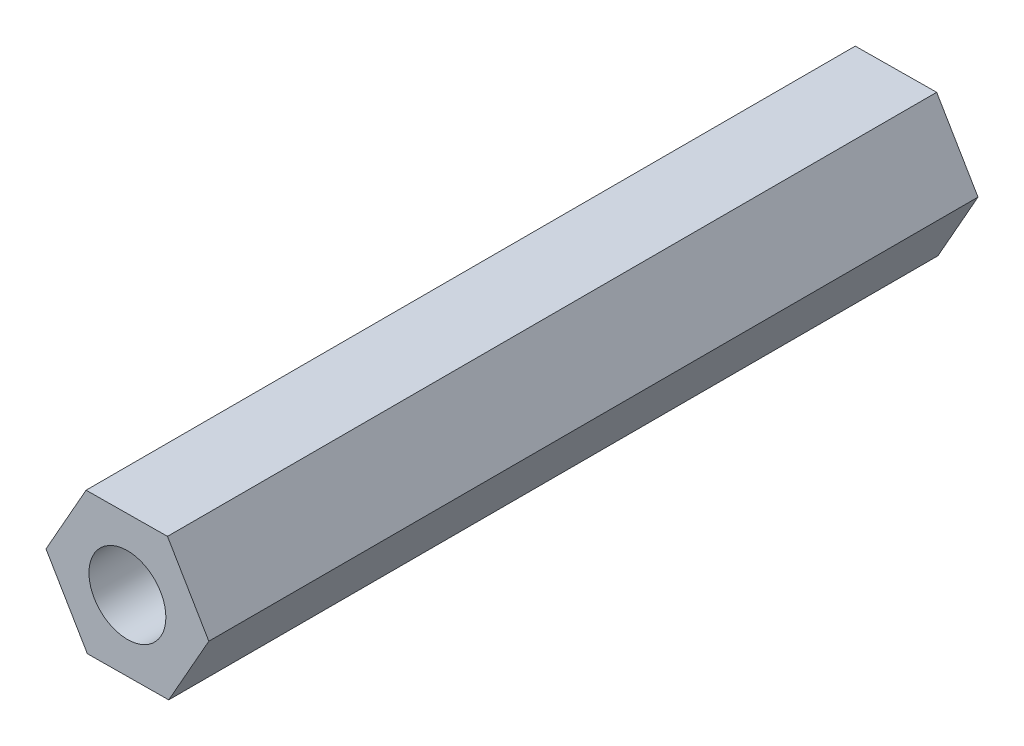
ISO-10303-21;
HEADER;
FILE_DESCRIPTION(('STEP AP214'),'2;1');
FILE_NAME('part.step','',(''),(''),'','','');
FILE_SCHEMA(('AUTOMOTIVE_DESIGN { 1 0 10303 214 1 1 1 1 }'));
ENDSEC;
DATA;
#1=APPLICATION_CONTEXT('core data for automotive mechanical design processes');
#2=APPLICATION_PROTOCOL_DEFINITION('international standard','automotive_design',2000,#1);
#3=PRODUCT_CONTEXT('',#1,'mechanical');
#4=PRODUCT('Part','Part','',(#3));
#5=PRODUCT_RELATED_PRODUCT_CATEGORY('part','',(#4));
#6=PRODUCT_DEFINITION_FORMATION('','',#4);
#7=PRODUCT_DEFINITION_CONTEXT('part definition',#1,'design');
#8=PRODUCT_DEFINITION('design','',#6,#7);
#9=PRODUCT_DEFINITION_SHAPE('','',#8);
#10=(LENGTH_UNIT() NAMED_UNIT(*) SI_UNIT(.MILLI.,.METRE.));
#11=(NAMED_UNIT(*) PLANE_ANGLE_UNIT() SI_UNIT($,.RADIAN.));
#12=(NAMED_UNIT(*) SI_UNIT($,.STERADIAN.) SOLID_ANGLE_UNIT());
#13=UNCERTAINTY_MEASURE_WITH_UNIT(LENGTH_MEASURE(1.E-05),#10,'distance_accuracy_value','');
#14=(GEOMETRIC_REPRESENTATION_CONTEXT(3) GLOBAL_UNCERTAINTY_ASSIGNED_CONTEXT((#13)) GLOBAL_UNIT_ASSIGNED_CONTEXT((#10,
#11,#12)) REPRESENTATION_CONTEXT('',''));
#15=CARTESIAN_POINT('',(0.,0.,0.));
#16=DIRECTION('',(0.,0.,1.));
#17=DIRECTION('',(1.,0.,0.));
#18=AXIS2_PLACEMENT_3D('',#15,#16,#17);
#19=CARTESIAN_POINT('',(0.,0.,30.));
#20=DIRECTION('',(0.,0.,1.));
#21=DIRECTION('',(1.,0.,0.));
#22=AXIS2_PLACEMENT_3D('',#19,#20,#21);
#23=PLANE('',#22);
#24=DIRECTION('',(0.999961257640527,0.00880245522430783,0.));
#25=VECTOR('',#24,1.);
#26=CARTESIAN_POINT('',(-1.56344497664753,-2.76386923321798,30.));
#27=LINE('',#26,#25);
#28=CARTESIAN_POINT('',(-1.56344497664753,-2.76386923321798,30.));
#29=VERTEX_POINT('',#28);
#30=CARTESIAN_POINT('',(1.61185848038122,-2.73591768380492,30.));
#31=VERTEX_POINT('',#30);
#32=EDGE_CURVE('E132',#29,#31,#27,.T.);
#33=ORIENTED_EDGE('',*,*,#32,.T.);
#34=DIRECTION('',(0.492357478980338,0.870393079529086,0.));
#35=VECTOR('',#34,1.);
#36=CARTESIAN_POINT('',(1.61185848038122,-2.73591768380492,30.));
#37=LINE('',#36,#35);
#38=CARTESIAN_POINT('',(3.17530345702875,0.0279515494130611,30.));
#39=VERTEX_POINT('',#38);
#40=EDGE_CURVE('E90',#31,#39,#37,.T.);
#41=ORIENTED_EDGE('',*,*,#40,.T.);
#42=DIRECTION('',(-0.507603778660189,0.861590624304778,0.));
#43=VECTOR('',#42,1.);
#44=CARTESIAN_POINT('',(3.17530345702875,0.0279515494130611,30.));
#45=LINE('',#44,#43);
#46=CARTESIAN_POINT('',(1.56344497664753,2.76386923321798,30.));
#47=VERTEX_POINT('',#46);
#48=EDGE_CURVE('E103',#39,#47,#45,.T.);
#49=ORIENTED_EDGE('',*,*,#48,.T.);
#50=DIRECTION('',(-0.999961257640527,-0.00880245522430783,0.));
#51=VECTOR('',#50,1.);
#52=CARTESIAN_POINT('',(1.56344497664753,2.76386923321798,30.));
#53=LINE('',#52,#51);
#54=CARTESIAN_POINT('',(-1.61185848038122,2.73591768380492,30.));
#55=VERTEX_POINT('',#54);
#56=EDGE_CURVE('E97',#47,#55,#53,.T.);
#57=ORIENTED_EDGE('',*,*,#56,.T.);
#58=DIRECTION('',(-0.492357478980338,-0.870393079529086,0.));
#59=VECTOR('',#58,1.);
#60=CARTESIAN_POINT('',(-1.61185848038122,2.73591768380492,30.));
#61=LINE('',#60,#59);
#62=CARTESIAN_POINT('',(-3.17530345702875,-0.02795154941306,30.));
#63=VERTEX_POINT('',#62);
#64=EDGE_CURVE('E101',#55,#63,#61,.T.);
#65=ORIENTED_EDGE('',*,*,#64,.T.);
#66=DIRECTION('',(0.507603778660189,-0.861590624304779,0.));
#67=VECTOR('',#66,1.);
#68=CARTESIAN_POINT('',(-3.17530345702875,-0.02795154941306,30.));
#69=LINE('',#68,#67);
#70=EDGE_CURVE('E53',#63,#29,#69,.T.);
#71=ORIENTED_EDGE('',*,*,#70,.T.);
#72=EDGE_LOOP('',(#33,#41,#49,#57,#65,#71));
#73=FACE_BOUND('',#72,.T.);
#74=CARTESIAN_POINT('',(0.,0.,30.));
#75=DIRECTION('',(0.,0.,1.));
#76=DIRECTION('',(1.,0.,0.));
#77=AXIS2_PLACEMENT_3D('',#74,#75,#76);
#78=CIRCLE('',#77,1.5);
#79=CARTESIAN_POINT('',(1.5,0.,30.));
#80=VERTEX_POINT('',#79);
#81=EDGE_CURVE('E125',#80,#80,#78,.T.);
#82=ORIENTED_EDGE('',*,*,#81,.F.);
#83=EDGE_LOOP('',(#82));
#84=FACE_BOUND('',#83,.T.);
#85=ADVANCED_FACE('F36',(#73,#84),#23,.T.);
#86=CARTESIAN_POINT('',(0.,0.,0.));
#87=DIRECTION('',(0.,0.,1.));
#88=DIRECTION('',(1.,0.,0.));
#89=AXIS2_PLACEMENT_3D('',#86,#87,#88);
#90=PLANE('',#89);
#91=DIRECTION('',(0.999961257640527,0.00880245522430783,0.));
#92=VECTOR('',#91,1.);
#93=CARTESIAN_POINT('',(-1.56344497664753,-2.76386923321798,0.));
#94=LINE('',#93,#92);
#95=CARTESIAN_POINT('',(-1.56344497664753,-2.76386923321798,0.));
#96=VERTEX_POINT('',#95);
#97=CARTESIAN_POINT('',(1.61185848038122,-2.73591768380492,0.));
#98=VERTEX_POINT('',#97);
#99=EDGE_CURVE('E121',#96,#98,#94,.T.);
#100=ORIENTED_EDGE('',*,*,#99,.F.);
#101=DIRECTION('',(0.507603778660189,-0.861590624304779,0.));
#102=VECTOR('',#101,1.);
#103=CARTESIAN_POINT('',(-3.17530345702875,-0.02795154941306,0.));
#104=LINE('',#103,#102);
#105=CARTESIAN_POINT('',(-3.17530345702875,-0.02795154941306,0.));
#106=VERTEX_POINT('',#105);
#107=EDGE_CURVE('E82',#106,#96,#104,.T.);
#108=ORIENTED_EDGE('',*,*,#107,.F.);
#109=DIRECTION('',(-0.492357478980338,-0.870393079529086,0.));
#110=VECTOR('',#109,1.);
#111=CARTESIAN_POINT('',(-1.61185848038122,2.73591768380492,0.));
#112=LINE('',#111,#110);
#113=CARTESIAN_POINT('',(-1.61185848038122,2.73591768380492,0.));
#114=VERTEX_POINT('',#113);
#115=EDGE_CURVE('E76',#114,#106,#112,.T.);
#116=ORIENTED_EDGE('',*,*,#115,.F.);
#117=DIRECTION('',(-0.999961257640527,-0.00880245522430783,0.));
#118=VECTOR('',#117,1.);
#119=CARTESIAN_POINT('',(1.56344497664753,2.76386923321798,0.));
#120=LINE('',#119,#118);
#121=CARTESIAN_POINT('',(1.56344497664753,2.76386923321798,0.));
#122=VERTEX_POINT('',#121);
#123=EDGE_CURVE('E111',#122,#114,#120,.T.);
#124=ORIENTED_EDGE('',*,*,#123,.F.);
#125=DIRECTION('',(-0.507603778660189,0.861590624304778,0.));
#126=VECTOR('',#125,1.);
#127=CARTESIAN_POINT('',(3.17530345702875,0.0279515494130611,0.));
#128=LINE('',#127,#126);
#129=CARTESIAN_POINT('',(3.17530345702875,0.0279515494130611,0.));
#130=VERTEX_POINT('',#129);
#131=EDGE_CURVE('E127',#130,#122,#128,.T.);
#132=ORIENTED_EDGE('',*,*,#131,.F.);
#133=DIRECTION('',(0.492357478980338,0.870393079529086,0.));
#134=VECTOR('',#133,1.);
#135=CARTESIAN_POINT('',(1.61185848038122,-2.73591768380492,0.));
#136=LINE('',#135,#134);
#137=EDGE_CURVE('E124',#98,#130,#136,.T.);
#138=ORIENTED_EDGE('',*,*,#137,.F.);
#139=EDGE_LOOP('',(#100,#108,#116,#124,#132,#138));
#140=FACE_BOUND('',#139,.T.);
#141=CARTESIAN_POINT('',(0.,0.,0.));
#142=DIRECTION('',(0.,0.,1.));
#143=DIRECTION('',(1.,0.,0.));
#144=AXIS2_PLACEMENT_3D('',#141,#142,#143);
#145=CIRCLE('',#144,1.5);
#146=CARTESIAN_POINT('',(1.5,0.,0.));
#147=VERTEX_POINT('',#146);
#148=EDGE_CURVE('E225',#147,#147,#145,.T.);
#149=ORIENTED_EDGE('',*,*,#148,.T.);
#150=EDGE_LOOP('',(#149));
#151=FACE_BOUND('',#150,.T.);
#152=ADVANCED_FACE('F141',(#140,#151),#90,.F.);
#153=CARTESIAN_POINT('',(-1.56344497664753,-2.76386923321798,30.));
#154=DIRECTION('',(-0.00880245522430783,0.999961257640527,0.));
#155=DIRECTION('',(-0.999961257640527,-0.00880245522430783,0.));
#156=AXIS2_PLACEMENT_3D('',#153,#154,#155);
#157=PLANE('',#156);
#158=ORIENTED_EDGE('',*,*,#99,.T.);
#159=DIRECTION('',(0.,0.,-1.));
#160=VECTOR('',#159,1.);
#161=CARTESIAN_POINT('',(1.61185848038122,-2.73591768380492,30.));
#162=LINE('',#161,#160);
#163=EDGE_CURVE('E11',#31,#98,#162,.T.);
#164=ORIENTED_EDGE('',*,*,#163,.F.);
#165=ORIENTED_EDGE('',*,*,#32,.F.);
#166=DIRECTION('',(0.,0.,-1.));
#167=VECTOR('',#166,1.);
#168=CARTESIAN_POINT('',(-1.56344497664753,-2.76386923321798,30.));
#169=LINE('',#168,#167);
#170=EDGE_CURVE('E117',#29,#96,#169,.T.);
#171=ORIENTED_EDGE('',*,*,#170,.T.);
#172=EDGE_LOOP('',(#158,#164,#165,#171));
#173=FACE_BOUND('',#172,.T.);
#174=ADVANCED_FACE('F38',(#173),#157,.F.);
#175=CARTESIAN_POINT('',(1.61185848038122,-2.73591768380492,30.));
#176=DIRECTION('',(-0.870393079529086,0.492357478980338,0.));
#177=DIRECTION('',(-0.492357478980338,-0.870393079529086,0.));
#178=AXIS2_PLACEMENT_3D('',#175,#176,#177);
#179=PLANE('',#178);
#180=ORIENTED_EDGE('',*,*,#137,.T.);
#181=DIRECTION('',(0.,0.,-1.));
#182=VECTOR('',#181,1.);
#183=CARTESIAN_POINT('',(3.17530345702875,0.0279515494130611,30.));
#184=LINE('',#183,#182);
#185=EDGE_CURVE('E45',#39,#130,#184,.T.);
#186=ORIENTED_EDGE('',*,*,#185,.F.);
#187=ORIENTED_EDGE('',*,*,#40,.F.);
#188=ORIENTED_EDGE('',*,*,#163,.T.);
#189=EDGE_LOOP('',(#180,#186,#187,#188));
#190=FACE_BOUND('',#189,.T.);
#191=ADVANCED_FACE('F166',(#190),#179,.F.);
#192=CARTESIAN_POINT('',(3.17530345702875,0.0279515494130611,30.));
#193=DIRECTION('',(-0.861590624304778,-0.507603778660189,0.));
#194=DIRECTION('',(0.507603778660189,-0.861590624304779,0.));
#195=AXIS2_PLACEMENT_3D('',#192,#193,#194);
#196=PLANE('',#195);
#197=ORIENTED_EDGE('',*,*,#131,.T.);
#198=DIRECTION('',(0.,0.,-1.));
#199=VECTOR('',#198,1.);
#200=CARTESIAN_POINT('',(1.56344497664753,2.76386923321798,30.));
#201=LINE('',#200,#199);
#202=EDGE_CURVE('E112',#47,#122,#201,.T.);
#203=ORIENTED_EDGE('',*,*,#202,.F.);
#204=ORIENTED_EDGE('',*,*,#48,.F.);
#205=ORIENTED_EDGE('',*,*,#185,.T.);
#206=EDGE_LOOP('',(#197,#203,#204,#205));
#207=FACE_BOUND('',#206,.T.);
#208=ADVANCED_FACE('F138',(#207),#196,.F.);
#209=CARTESIAN_POINT('',(1.56344497664753,2.76386923321798,30.));
#210=DIRECTION('',(0.00880245522430783,-0.999961257640527,0.));
#211=DIRECTION('',(0.999961257640527,0.00880245522430783,0.));
#212=AXIS2_PLACEMENT_3D('',#209,#210,#211);
#213=PLANE('',#212);
#214=ORIENTED_EDGE('',*,*,#123,.T.);
#215=DIRECTION('',(0.,0.,-1.));
#216=VECTOR('',#215,1.);
#217=CARTESIAN_POINT('',(-1.61185848038122,2.73591768380492,30.));
#218=LINE('',#217,#216);
#219=EDGE_CURVE('E108',#55,#114,#218,.T.);
#220=ORIENTED_EDGE('',*,*,#219,.F.);
#221=ORIENTED_EDGE('',*,*,#56,.F.);
#222=ORIENTED_EDGE('',*,*,#202,.T.);
#223=EDGE_LOOP('',(#214,#220,#221,#222));
#224=FACE_BOUND('',#223,.T.);
#225=ADVANCED_FACE('F109',(#224),#213,.F.);
#226=CARTESIAN_POINT('',(-1.61185848038122,2.73591768380492,30.));
#227=DIRECTION('',(0.870393079529086,-0.492357478980338,0.));
#228=DIRECTION('',(0.492357478980338,0.870393079529086,0.));
#229=AXIS2_PLACEMENT_3D('',#226,#227,#228);
#230=PLANE('',#229);
#231=ORIENTED_EDGE('',*,*,#115,.T.);
#232=DIRECTION('',(0.,0.,-1.));
#233=VECTOR('',#232,1.);
#234=CARTESIAN_POINT('',(-3.17530345702875,-0.02795154941306,30.));
#235=LINE('',#234,#233);
#236=EDGE_CURVE('E113',#63,#106,#235,.T.);
#237=ORIENTED_EDGE('',*,*,#236,.F.);
#238=ORIENTED_EDGE('',*,*,#64,.F.);
#239=ORIENTED_EDGE('',*,*,#219,.T.);
#240=EDGE_LOOP('',(#231,#237,#238,#239));
#241=FACE_BOUND('',#240,.T.);
#242=ADVANCED_FACE('F115',(#241),#230,.F.);
#243=CARTESIAN_POINT('',(-3.17530345702875,-0.02795154941306,30.));
#244=DIRECTION('',(0.861590624304778,0.507603778660189,0.));
#245=DIRECTION('',(-0.507603778660189,0.861590624304779,0.));
#246=AXIS2_PLACEMENT_3D('',#243,#244,#245);
#247=PLANE('',#246);
#248=ORIENTED_EDGE('',*,*,#107,.T.);
#249=ORIENTED_EDGE('',*,*,#170,.F.);
#250=ORIENTED_EDGE('',*,*,#70,.F.);
#251=ORIENTED_EDGE('',*,*,#236,.T.);
#252=EDGE_LOOP('',(#248,#249,#250,#251));
#253=FACE_BOUND('',#252,.T.);
#254=ADVANCED_FACE('F146',(#253),#247,.F.);
#255=CARTESIAN_POINT('',(0.,0.,30.));
#256=DIRECTION('',(0.,0.,-1.));
#257=DIRECTION('',(-1.,0.,0.));
#258=AXIS2_PLACEMENT_3D('',#255,#256,#257);
#259=CYLINDRICAL_SURFACE('',#258,1.5);
#260=ORIENTED_EDGE('',*,*,#81,.T.);
#261=EDGE_LOOP('',(#260));
#262=FACE_BOUND('',#261,.T.);
#263=ORIENTED_EDGE('',*,*,#148,.F.);
#264=EDGE_LOOP('',(#263));
#265=FACE_BOUND('',#264,.T.);
#266=ADVANCED_FACE('F148',(#262,#265),#259,.F.);
#267=CLOSED_SHELL('',(#85,#152,#174,#191,#208,#225,#242,#254,#266));
#268=MANIFOLD_SOLID_BREP('B2',#267);
#269=ADVANCED_BREP_SHAPE_REPRESENTATION('',(#18,#268),#14);
#270=SHAPE_DEFINITION_REPRESENTATION(#9,#269);
ENDSEC;
END-ISO-10303-21;
